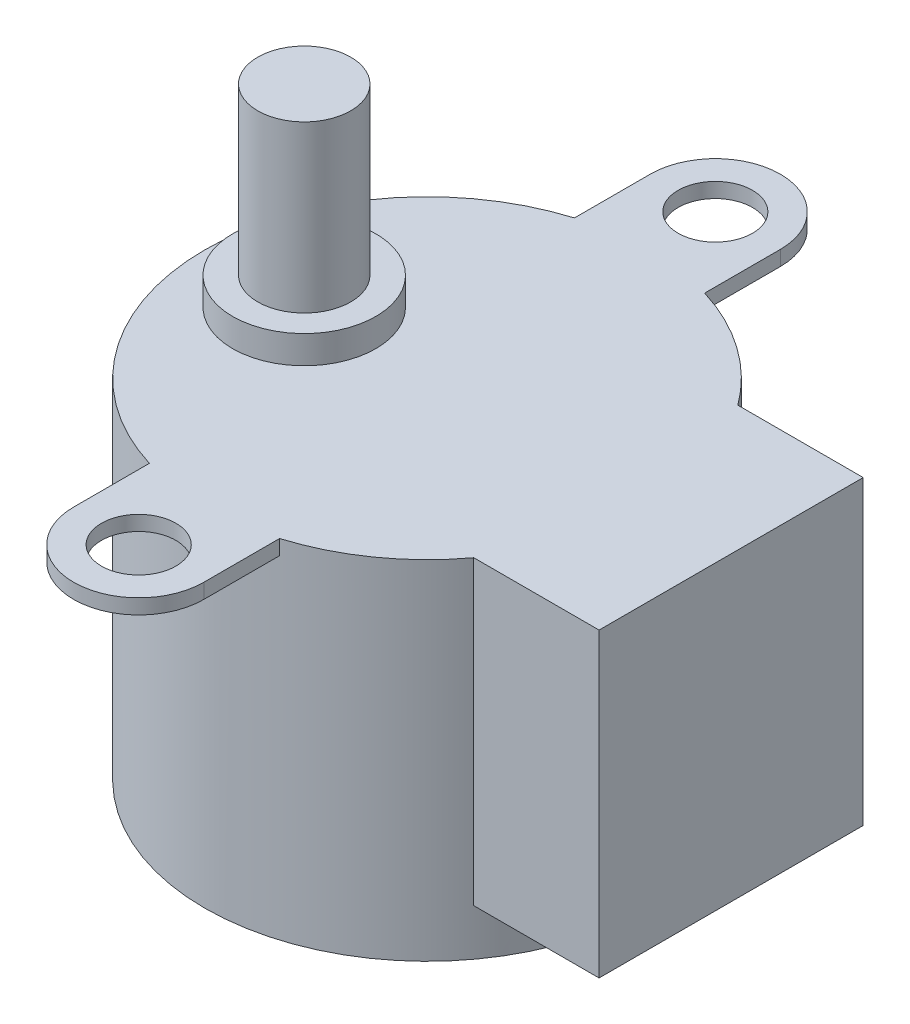
ISO-10303-21;
HEADER;
FILE_DESCRIPTION(('STEP AP214'),'2;1');
FILE_NAME('part.step','',(''),(''),'','','');
FILE_SCHEMA(('AUTOMOTIVE_DESIGN { 1 0 10303 214 1 1 1 1 }'));
ENDSEC;
DATA;
#1=APPLICATION_CONTEXT('core data for automotive mechanical design processes');
#2=APPLICATION_PROTOCOL_DEFINITION('international standard','automotive_design',2000,#1);
#3=PRODUCT_CONTEXT('',#1,'mechanical');
#4=PRODUCT('Part','Part','',(#3));
#5=PRODUCT_RELATED_PRODUCT_CATEGORY('part','',(#4));
#6=PRODUCT_DEFINITION_FORMATION('','',#4);
#7=PRODUCT_DEFINITION_CONTEXT('part definition',#1,'design');
#8=PRODUCT_DEFINITION('design','',#6,#7);
#9=PRODUCT_DEFINITION_SHAPE('','',#8);
#10=(LENGTH_UNIT() NAMED_UNIT(*) SI_UNIT(.MILLI.,.METRE.));
#11=(NAMED_UNIT(*) PLANE_ANGLE_UNIT() SI_UNIT($,.RADIAN.));
#12=(NAMED_UNIT(*) SI_UNIT($,.STERADIAN.) SOLID_ANGLE_UNIT());
#13=UNCERTAINTY_MEASURE_WITH_UNIT(LENGTH_MEASURE(1.E-05),#10,'distance_accuracy_value','');
#14=(GEOMETRIC_REPRESENTATION_CONTEXT(3) GLOBAL_UNCERTAINTY_ASSIGNED_CONTEXT((#13)) GLOBAL_UNIT_ASSIGNED_CONTEXT((#10,
#11,#12)) REPRESENTATION_CONTEXT('',''));
#15=CARTESIAN_POINT('',(0.,0.,0.));
#16=DIRECTION('',(0.,0.,1.));
#17=DIRECTION('',(1.,0.,0.));
#18=AXIS2_PLACEMENT_3D('',#15,#16,#17);
#19=CARTESIAN_POINT('',(0.,18.7,0.));
#20=DIRECTION('',(0.,-1.,0.));
#21=DIRECTION('',(0.,0.,-1.));
#22=AXIS2_PLACEMENT_3D('',#19,#20,#21);
#23=CYLINDRICAL_SURFACE('',#22,11.95);
#24=CARTESIAN_POINT('',(0.,0.,0.));
#25=DIRECTION('',(0.,1.,0.));
#26=DIRECTION('',(0.,0.,1.));
#27=AXIS2_PLACEMENT_3D('',#24,#25,#26);
#28=CIRCLE('',#27,11.95);
#29=CARTESIAN_POINT('',(0.,0.,11.95));
#30=VERTEX_POINT('',#29);
#31=EDGE_CURVE('E38',#30,#30,#28,.T.);
#32=ORIENTED_EDGE('',*,*,#31,.T.);
#33=EDGE_LOOP('',(#32));
#34=FACE_BOUND('',#33,.T.);
#35=CARTESIAN_POINT('',(0.,18.7,0.));
#36=DIRECTION('',(0.,1.,0.));
#37=DIRECTION('',(0.,0.,1.));
#38=AXIS2_PLACEMENT_3D('',#35,#36,#37);
#39=CIRCLE('',#38,11.95);
#40=CARTESIAN_POINT('',(3.5,18.7,11.4259572903105));
#41=VERTEX_POINT('',#40);
#42=CARTESIAN_POINT('',(9.61210174727671,18.7,7.1));
#43=VERTEX_POINT('',#42);
#44=EDGE_CURVE('E44',#41,#43,#39,.T.);
#45=ORIENTED_EDGE('',*,*,#44,.F.);
#46=DIRECTION('',(0.,1.,0.));
#47=VECTOR('',#46,1.);
#48=CARTESIAN_POINT('',(3.5,17.9,11.4259572903105));
#49=LINE('',#48,#47);
#50=CARTESIAN_POINT('',(3.5,17.9,11.4259572903105));
#51=VERTEX_POINT('',#50);
#52=EDGE_CURVE('E143',#51,#41,#49,.T.);
#53=ORIENTED_EDGE('',*,*,#52,.F.);
#54=CARTESIAN_POINT('',(0.,17.9,0.));
#55=DIRECTION('',(0.,1.,0.));
#56=DIRECTION('',(0.,0.,1.));
#57=AXIS2_PLACEMENT_3D('',#54,#55,#56);
#58=CIRCLE('',#57,11.95);
#59=CARTESIAN_POINT('',(-3.5,17.9,11.4259572903105));
#60=VERTEX_POINT('',#59);
#61=EDGE_CURVE('E127',#60,#51,#58,.T.);
#62=ORIENTED_EDGE('',*,*,#61,.F.);
#63=DIRECTION('',(0.,1.,0.));
#64=VECTOR('',#63,1.);
#65=CARTESIAN_POINT('',(-3.5,17.9,11.4259572903105));
#66=LINE('',#65,#64);
#67=CARTESIAN_POINT('',(-3.5,18.7,11.4259572903105));
#68=VERTEX_POINT('',#67);
#69=EDGE_CURVE('E149',#60,#68,#66,.T.);
#70=ORIENTED_EDGE('',*,*,#69,.T.);
#71=CARTESIAN_POINT('',(-3.5,18.7,-11.4259572903105));
#72=VERTEX_POINT('',#71);
#73=EDGE_CURVE('E43',#72,#68,#39,.T.);
#74=ORIENTED_EDGE('',*,*,#73,.F.);
#75=DIRECTION('',(0.,1.,0.));
#76=VECTOR('',#75,1.);
#77=CARTESIAN_POINT('',(-3.5,17.9,-11.4259572903105));
#78=LINE('',#77,#76);
#79=CARTESIAN_POINT('',(-3.5,17.9,-11.4259572903105));
#80=VERTEX_POINT('',#79);
#81=EDGE_CURVE('E185',#80,#72,#78,.T.);
#82=ORIENTED_EDGE('',*,*,#81,.F.);
#83=CARTESIAN_POINT('',(0.,17.9,0.));
#84=DIRECTION('',(0.,1.,0.));
#85=DIRECTION('',(0.,0.,1.));
#86=AXIS2_PLACEMENT_3D('',#83,#84,#85);
#87=CIRCLE('',#86,11.95);
#88=CARTESIAN_POINT('',(3.5,17.9,-11.4259572903105));
#89=VERTEX_POINT('',#88);
#90=EDGE_CURVE('E170',#89,#80,#87,.T.);
#91=ORIENTED_EDGE('',*,*,#90,.F.);
#92=DIRECTION('',(0.,1.,0.));
#93=VECTOR('',#92,1.);
#94=CARTESIAN_POINT('',(3.5,17.9,-11.4259572903105));
#95=LINE('',#94,#93);
#96=CARTESIAN_POINT('',(3.5,18.7,-11.4259572903105));
#97=VERTEX_POINT('',#96);
#98=EDGE_CURVE('E181',#89,#97,#95,.T.);
#99=ORIENTED_EDGE('',*,*,#98,.T.);
#100=CARTESIAN_POINT('',(9.61210174727671,18.7,-7.1));
#101=VERTEX_POINT('',#100);
#102=EDGE_CURVE('E11',#101,#97,#39,.T.);
#103=ORIENTED_EDGE('',*,*,#102,.F.);
#104=DIRECTION('',(0.,1.,0.));
#105=VECTOR('',#104,1.);
#106=CARTESIAN_POINT('',(9.61210174727671,2.5,-7.1));
#107=LINE('',#106,#105);
#108=CARTESIAN_POINT('',(9.61210174727671,2.5,-7.1));
#109=VERTEX_POINT('',#108);
#110=EDGE_CURVE('E208',#109,#101,#107,.T.);
#111=ORIENTED_EDGE('',*,*,#110,.F.);
#112=CARTESIAN_POINT('',(0.,2.5,0.));
#113=DIRECTION('',(0.,1.,0.));
#114=DIRECTION('',(0.,0.,1.));
#115=AXIS2_PLACEMENT_3D('',#112,#113,#114);
#116=CIRCLE('',#115,11.95);
#117=CARTESIAN_POINT('',(9.61210174727671,2.5,7.1));
#118=VERTEX_POINT('',#117);
#119=EDGE_CURVE('E190',#118,#109,#116,.T.);
#120=ORIENTED_EDGE('',*,*,#119,.F.);
#121=DIRECTION('',(0.,1.,0.));
#122=VECTOR('',#121,1.);
#123=CARTESIAN_POINT('',(9.61210174727671,2.5,7.1));
#124=LINE('',#123,#122);
#125=EDGE_CURVE('E201',#118,#43,#124,.T.);
#126=ORIENTED_EDGE('',*,*,#125,.T.);
#127=EDGE_LOOP('',(#45,#53,#62,#70,#74,#82,#91,#99,#103,#111,#120,#126));
#128=FACE_BOUND('',#127,.T.);
#129=ADVANCED_FACE('F35',(#34,#128),#23,.T.);
#130=CARTESIAN_POINT('',(0.,18.7,0.));
#131=DIRECTION('',(0.,1.,0.));
#132=DIRECTION('',(0.,0.,1.));
#133=AXIS2_PLACEMENT_3D('',#130,#131,#132);
#134=PLANE('',#133);
#135=CARTESIAN_POINT('',(-6.6,18.7,0.));
#136=DIRECTION('',(0.,1.,0.));
#137=DIRECTION('',(0.,0.,1.));
#138=AXIS2_PLACEMENT_3D('',#135,#136,#137);
#139=CIRCLE('',#138,3.85);
#140=CARTESIAN_POINT('',(-6.6,18.7,3.85));
#141=VERTEX_POINT('',#140);
#142=EDGE_CURVE('E474',#141,#141,#139,.T.);
#143=ORIENTED_EDGE('',*,*,#142,.F.);
#144=EDGE_LOOP('',(#143));
#145=FACE_BOUND('',#144,.T.);
#146=ORIENTED_EDGE('',*,*,#102,.T.);
#147=DIRECTION('',(0.,0.,1.));
#148=VECTOR('',#147,1.);
#149=CARTESIAN_POINT('',(3.50000000000001,18.7,0.));
#150=LINE('',#149,#148);
#151=CARTESIAN_POINT('',(3.49999999999999,18.7,-15.5));
#152=VERTEX_POINT('',#151);
#153=EDGE_CURVE('E176',#152,#97,#150,.T.);
#154=ORIENTED_EDGE('',*,*,#153,.F.);
#155=CARTESIAN_POINT('',(0.,18.7,-15.5));
#156=DIRECTION('',(0.,1.,0.));
#157=DIRECTION('',(0.,0.,1.));
#158=AXIS2_PLACEMENT_3D('',#155,#156,#157);
#159=CIRCLE('',#158,3.5);
#160=CARTESIAN_POINT('',(-3.50000000000001,18.7,-15.5));
#161=VERTEX_POINT('',#160);
#162=EDGE_CURVE('E178',#152,#161,#159,.T.);
#163=ORIENTED_EDGE('',*,*,#162,.T.);
#164=DIRECTION('',(0.,0.,1.));
#165=VECTOR('',#164,1.);
#166=CARTESIAN_POINT('',(-3.49999999999998,18.7,0.));
#167=LINE('',#166,#165);
#168=EDGE_CURVE('E58',#161,#72,#167,.T.);
#169=ORIENTED_EDGE('',*,*,#168,.T.);
#170=ORIENTED_EDGE('',*,*,#73,.T.);
#171=DIRECTION('',(0.,0.,-1.));
#172=VECTOR('',#171,1.);
#173=CARTESIAN_POINT('',(-3.49999999999999,18.7,0.));
#174=LINE('',#173,#172);
#175=CARTESIAN_POINT('',(-3.5,18.7,15.5));
#176=VERTEX_POINT('',#175);
#177=EDGE_CURVE('E466',#176,#68,#174,.T.);
#178=ORIENTED_EDGE('',*,*,#177,.F.);
#179=CARTESIAN_POINT('',(0.,18.7,15.5));
#180=DIRECTION('',(0.,1.,0.));
#181=DIRECTION('',(0.,0.,1.));
#182=AXIS2_PLACEMENT_3D('',#179,#180,#181);
#183=CIRCLE('',#182,3.5);
#184=CARTESIAN_POINT('',(3.5,18.7,15.5));
#185=VERTEX_POINT('',#184);
#186=EDGE_CURVE('E464',#176,#185,#183,.T.);
#187=ORIENTED_EDGE('',*,*,#186,.T.);
#188=DIRECTION('',(0.,0.,-1.));
#189=VECTOR('',#188,1.);
#190=CARTESIAN_POINT('',(3.5,18.7,0.));
#191=LINE('',#190,#189);
#192=EDGE_CURVE('E51',#185,#41,#191,.T.);
#193=ORIENTED_EDGE('',*,*,#192,.T.);
#194=ORIENTED_EDGE('',*,*,#44,.T.);
#195=DIRECTION('',(-1.,0.,0.));
#196=VECTOR('',#195,1.);
#197=CARTESIAN_POINT('',(0.,18.7,7.1));
#198=LINE('',#197,#196);
#199=CARTESIAN_POINT('',(16.35,18.7,7.1));
#200=VERTEX_POINT('',#199);
#201=EDGE_CURVE('E184',#200,#43,#198,.T.);
#202=ORIENTED_EDGE('',*,*,#201,.F.);
#203=DIRECTION('',(0.,0.,-1.));
#204=VECTOR('',#203,1.);
#205=CARTESIAN_POINT('',(16.35,18.7,0.));
#206=LINE('',#205,#204);
#207=CARTESIAN_POINT('',(16.35,18.7,-7.1));
#208=VERTEX_POINT('',#207);
#209=EDGE_CURVE('E204',#200,#208,#206,.T.);
#210=ORIENTED_EDGE('',*,*,#209,.T.);
#211=DIRECTION('',(-1.,0.,0.));
#212=VECTOR('',#211,1.);
#213=CARTESIAN_POINT('',(0.,18.7,-7.1));
#214=LINE('',#213,#212);
#215=EDGE_CURVE('E193',#208,#101,#214,.T.);
#216=ORIENTED_EDGE('',*,*,#215,.T.);
#217=EDGE_LOOP('',(#146,#154,#163,#169,#170,#178,#187,#193,#194,#202,#210,#216));
#218=FACE_BOUND('',#217,.T.);
#219=CARTESIAN_POINT('',(0.,18.7,-15.5));
#220=DIRECTION('',(0.,1.,0.));
#221=DIRECTION('',(0.,0.,1.));
#222=AXIS2_PLACEMENT_3D('',#219,#220,#221);
#223=CIRCLE('',#222,2.);
#224=CARTESIAN_POINT('',(0.,18.7,-13.5));
#225=VERTEX_POINT('',#224);
#226=EDGE_CURVE('E173',#225,#225,#223,.T.);
#227=ORIENTED_EDGE('',*,*,#226,.F.);
#228=EDGE_LOOP('',(#227));
#229=FACE_BOUND('',#228,.T.);
#230=CARTESIAN_POINT('',(0.,18.7,15.5));
#231=DIRECTION('',(0.,1.,0.));
#232=DIRECTION('',(0.,0.,1.));
#233=AXIS2_PLACEMENT_3D('',#230,#231,#232);
#234=CIRCLE('',#233,2.);
#235=CARTESIAN_POINT('',(0.,18.7,17.5));
#236=VERTEX_POINT('',#235);
#237=EDGE_CURVE('E146',#236,#236,#234,.T.);
#238=ORIENTED_EDGE('',*,*,#237,.F.);
#239=EDGE_LOOP('',(#238));
#240=FACE_BOUND('',#239,.T.);
#241=ADVANCED_FACE('F224',(#145,#218,#229,#240),#134,.T.);
#242=CARTESIAN_POINT('',(0.,0.,0.));
#243=DIRECTION('',(0.,1.,0.));
#244=DIRECTION('',(0.,0.,1.));
#245=AXIS2_PLACEMENT_3D('',#242,#243,#244);
#246=PLANE('',#245);
#247=ORIENTED_EDGE('',*,*,#31,.F.);
#248=EDGE_LOOP('',(#247));
#249=FACE_BOUND('',#248,.T.);
#250=ADVANCED_FACE('F253',(#249),#246,.F.);
#251=CARTESIAN_POINT('',(0.,2.5,-7.1));
#252=DIRECTION('',(0.,0.,-1.));
#253=DIRECTION('',(-1.,0.,0.));
#254=AXIS2_PLACEMENT_3D('',#251,#252,#253);
#255=PLANE('',#254);
#256=ORIENTED_EDGE('',*,*,#215,.F.);
#257=DIRECTION('',(0.,1.,0.));
#258=VECTOR('',#257,1.);
#259=CARTESIAN_POINT('',(16.35,2.5,-7.1));
#260=LINE('',#259,#258);
#261=CARTESIAN_POINT('',(16.35,2.5,-7.1));
#262=VERTEX_POINT('',#261);
#263=EDGE_CURVE('E211',#262,#208,#260,.T.);
#264=ORIENTED_EDGE('',*,*,#263,.F.);
#265=DIRECTION('',(-1.,0.,0.));
#266=VECTOR('',#265,1.);
#267=CARTESIAN_POINT('',(0.,2.5,-7.1));
#268=LINE('',#267,#266);
#269=EDGE_CURVE('E198',#262,#109,#268,.T.);
#270=ORIENTED_EDGE('',*,*,#269,.T.);
#271=ORIENTED_EDGE('',*,*,#110,.T.);
#272=EDGE_LOOP('',(#256,#264,#270,#271));
#273=FACE_BOUND('',#272,.T.);
#274=ADVANCED_FACE('F231',(#273),#255,.T.);
#275=CARTESIAN_POINT('',(16.35,2.5,0.));
#276=DIRECTION('',(1.,0.,0.));
#277=DIRECTION('',(0.,0.,-1.));
#278=AXIS2_PLACEMENT_3D('',#275,#276,#277);
#279=PLANE('',#278);
#280=ORIENTED_EDGE('',*,*,#209,.F.);
#281=DIRECTION('',(0.,1.,0.));
#282=VECTOR('',#281,1.);
#283=CARTESIAN_POINT('',(16.35,2.5,7.1));
#284=LINE('',#283,#282);
#285=CARTESIAN_POINT('',(16.35,2.5,7.1));
#286=VERTEX_POINT('',#285);
#287=EDGE_CURVE('E213',#286,#200,#284,.T.);
#288=ORIENTED_EDGE('',*,*,#287,.F.);
#289=DIRECTION('',(0.,0.,-1.));
#290=VECTOR('',#289,1.);
#291=CARTESIAN_POINT('',(16.35,2.5,0.));
#292=LINE('',#291,#290);
#293=EDGE_CURVE('E195',#286,#262,#292,.T.);
#294=ORIENTED_EDGE('',*,*,#293,.T.);
#295=ORIENTED_EDGE('',*,*,#263,.T.);
#296=EDGE_LOOP('',(#280,#288,#294,#295));
#297=FACE_BOUND('',#296,.T.);
#298=ADVANCED_FACE('F228',(#297),#279,.T.);
#299=CARTESIAN_POINT('',(0.,2.5,7.1));
#300=DIRECTION('',(0.,0.,-1.));
#301=DIRECTION('',(-1.,0.,0.));
#302=AXIS2_PLACEMENT_3D('',#299,#300,#301);
#303=PLANE('',#302);
#304=ORIENTED_EDGE('',*,*,#201,.T.);
#305=ORIENTED_EDGE('',*,*,#125,.F.);
#306=DIRECTION('',(-1.,0.,0.));
#307=VECTOR('',#306,1.);
#308=CARTESIAN_POINT('',(0.,2.5,7.1));
#309=LINE('',#308,#307);
#310=EDGE_CURVE('E192',#286,#118,#309,.T.);
#311=ORIENTED_EDGE('',*,*,#310,.F.);
#312=ORIENTED_EDGE('',*,*,#287,.T.);
#313=EDGE_LOOP('',(#304,#305,#311,#312));
#314=FACE_BOUND('',#313,.T.);
#315=ADVANCED_FACE('F220',(#314),#303,.F.);
#316=CARTESIAN_POINT('',(0.,2.5,0.));
#317=DIRECTION('',(0.,1.,0.));
#318=DIRECTION('',(0.,0.,1.));
#319=AXIS2_PLACEMENT_3D('',#316,#317,#318);
#320=PLANE('',#319);
#321=ORIENTED_EDGE('',*,*,#119,.T.);
#322=ORIENTED_EDGE('',*,*,#269,.F.);
#323=ORIENTED_EDGE('',*,*,#293,.F.);
#324=ORIENTED_EDGE('',*,*,#310,.T.);
#325=EDGE_LOOP('',(#321,#322,#323,#324));
#326=FACE_BOUND('',#325,.T.);
#327=ADVANCED_FACE('F350',(#326),#320,.F.);
#328=CARTESIAN_POINT('',(3.50000000000001,17.9,0.));
#329=DIRECTION('',(-1.,0.,0.));
#330=DIRECTION('',(0.,0.,1.));
#331=AXIS2_PLACEMENT_3D('',#328,#329,#330);
#332=PLANE('',#331);
#333=ORIENTED_EDGE('',*,*,#153,.T.);
#334=ORIENTED_EDGE('',*,*,#98,.F.);
#335=DIRECTION('',(0.,0.,1.));
#336=VECTOR('',#335,1.);
#337=CARTESIAN_POINT('',(3.50000000000001,17.9,0.));
#338=LINE('',#337,#336);
#339=CARTESIAN_POINT('',(3.49999999999999,17.9,-15.5));
#340=VERTEX_POINT('',#339);
#341=EDGE_CURVE('E162',#340,#89,#338,.T.);
#342=ORIENTED_EDGE('',*,*,#341,.F.);
#343=DIRECTION('',(0.,1.,0.));
#344=VECTOR('',#343,1.);
#345=CARTESIAN_POINT('',(3.49999999999999,17.9,-15.5));
#346=LINE('',#345,#344);
#347=EDGE_CURVE('E172',#340,#152,#346,.T.);
#348=ORIENTED_EDGE('',*,*,#347,.T.);
#349=EDGE_LOOP('',(#333,#334,#342,#348));
#350=FACE_BOUND('',#349,.T.);
#351=ADVANCED_FACE('F240',(#350),#332,.F.);
#352=CARTESIAN_POINT('',(-3.49999999999998,17.9,0.));
#353=DIRECTION('',(-1.,0.,0.));
#354=DIRECTION('',(0.,0.,1.));
#355=AXIS2_PLACEMENT_3D('',#352,#353,#354);
#356=PLANE('',#355);
#357=ORIENTED_EDGE('',*,*,#168,.F.);
#358=DIRECTION('',(0.,1.,0.));
#359=VECTOR('',#358,1.);
#360=CARTESIAN_POINT('',(-3.50000000000001,17.9,-15.5));
#361=LINE('',#360,#359);
#362=CARTESIAN_POINT('',(-3.50000000000001,17.9,-15.5));
#363=VERTEX_POINT('',#362);
#364=EDGE_CURVE('E187',#363,#161,#361,.T.);
#365=ORIENTED_EDGE('',*,*,#364,.F.);
#366=DIRECTION('',(0.,0.,1.));
#367=VECTOR('',#366,1.);
#368=CARTESIAN_POINT('',(-3.49999999999998,17.9,0.));
#369=LINE('',#368,#367);
#370=EDGE_CURVE('E167',#363,#80,#369,.T.);
#371=ORIENTED_EDGE('',*,*,#370,.T.);
#372=ORIENTED_EDGE('',*,*,#81,.T.);
#373=EDGE_LOOP('',(#357,#365,#371,#372));
#374=FACE_BOUND('',#373,.T.);
#375=ADVANCED_FACE('F246',(#374),#356,.T.);
#376=CARTESIAN_POINT('',(0.,17.9,-15.5));
#377=DIRECTION('',(0.,1.,0.));
#378=DIRECTION('',(0.,0.,1.));
#379=AXIS2_PLACEMENT_3D('',#376,#377,#378);
#380=CYLINDRICAL_SURFACE('',#379,2.);
#381=CARTESIAN_POINT('',(0.,17.9,-15.5));
#382=DIRECTION('',(0.,1.,0.));
#383=DIRECTION('',(0.,0.,1.));
#384=AXIS2_PLACEMENT_3D('',#381,#382,#383);
#385=CIRCLE('',#384,2.);
#386=CARTESIAN_POINT('',(0.,17.9,-13.5));
#387=VERTEX_POINT('',#386);
#388=EDGE_CURVE('E159',#387,#387,#385,.T.);
#389=ORIENTED_EDGE('',*,*,#388,.F.);
#390=EDGE_LOOP('',(#389));
#391=FACE_BOUND('',#390,.T.);
#392=ORIENTED_EDGE('',*,*,#226,.T.);
#393=EDGE_LOOP('',(#392));
#394=FACE_BOUND('',#393,.T.);
#395=ADVANCED_FACE('F345',(#391,#394),#380,.F.);
#396=CARTESIAN_POINT('',(0.,17.9,-15.5));
#397=DIRECTION('',(0.,1.,0.));
#398=DIRECTION('',(0.,0.,1.));
#399=AXIS2_PLACEMENT_3D('',#396,#397,#398);
#400=CYLINDRICAL_SURFACE('',#399,3.5);
#401=ORIENTED_EDGE('',*,*,#162,.F.);
#402=ORIENTED_EDGE('',*,*,#347,.F.);
#403=CARTESIAN_POINT('',(0.,17.9,-15.5));
#404=DIRECTION('',(0.,1.,0.));
#405=DIRECTION('',(0.,0.,1.));
#406=AXIS2_PLACEMENT_3D('',#403,#404,#405);
#407=CIRCLE('',#406,3.5);
#408=EDGE_CURVE('E164',#340,#363,#407,.T.);
#409=ORIENTED_EDGE('',*,*,#408,.T.);
#410=ORIENTED_EDGE('',*,*,#364,.T.);
#411=EDGE_LOOP('',(#401,#402,#409,#410));
#412=FACE_BOUND('',#411,.T.);
#413=ADVANCED_FACE('F243',(#412),#400,.T.);
#414=CARTESIAN_POINT('',(0.,17.9,0.));
#415=DIRECTION('',(0.,1.,0.));
#416=DIRECTION('',(0.,0.,1.));
#417=AXIS2_PLACEMENT_3D('',#414,#415,#416);
#418=PLANE('',#417);
#419=ORIENTED_EDGE('',*,*,#388,.T.);
#420=EDGE_LOOP('',(#419));
#421=FACE_BOUND('',#420,.T.);
#422=ORIENTED_EDGE('',*,*,#341,.T.);
#423=ORIENTED_EDGE('',*,*,#90,.T.);
#424=ORIENTED_EDGE('',*,*,#370,.F.);
#425=ORIENTED_EDGE('',*,*,#408,.F.);
#426=EDGE_LOOP('',(#422,#423,#424,#425));
#427=FACE_BOUND('',#426,.T.);
#428=ADVANCED_FACE('F339',(#421,#427),#418,.F.);
#429=CARTESIAN_POINT('',(3.5,17.9,0.));
#430=DIRECTION('',(1.,0.,0.));
#431=DIRECTION('',(0.,0.,-1.));
#432=AXIS2_PLACEMENT_3D('',#429,#430,#431);
#433=PLANE('',#432);
#434=ORIENTED_EDGE('',*,*,#192,.F.);
#435=DIRECTION('',(0.,1.,0.));
#436=VECTOR('',#435,1.);
#437=CARTESIAN_POINT('',(3.5,17.9,15.5));
#438=LINE('',#437,#436);
#439=CARTESIAN_POINT('',(3.5,17.9,15.5));
#440=VERTEX_POINT('',#439);
#441=EDGE_CURVE('E145',#440,#185,#438,.T.);
#442=ORIENTED_EDGE('',*,*,#441,.F.);
#443=DIRECTION('',(0.,0.,-1.));
#444=VECTOR('',#443,1.);
#445=CARTESIAN_POINT('',(3.5,17.9,0.));
#446=LINE('',#445,#444);
#447=EDGE_CURVE('E132',#440,#51,#446,.T.);
#448=ORIENTED_EDGE('',*,*,#447,.T.);
#449=ORIENTED_EDGE('',*,*,#52,.T.);
#450=EDGE_LOOP('',(#434,#442,#448,#449));
#451=FACE_BOUND('',#450,.T.);
#452=ADVANCED_FACE('F142',(#451),#433,.T.);
#453=CARTESIAN_POINT('',(0.,17.9,15.5));
#454=DIRECTION('',(0.,1.,0.));
#455=DIRECTION('',(0.,0.,1.));
#456=AXIS2_PLACEMENT_3D('',#453,#454,#455);
#457=CYLINDRICAL_SURFACE('',#456,3.5);
#458=ORIENTED_EDGE('',*,*,#186,.F.);
#459=DIRECTION('',(0.,1.,0.));
#460=VECTOR('',#459,1.);
#461=CARTESIAN_POINT('',(-3.5,17.9,15.5));
#462=LINE('',#461,#460);
#463=CARTESIAN_POINT('',(-3.5,17.9,15.5));
#464=VERTEX_POINT('',#463);
#465=EDGE_CURVE('E152',#464,#176,#462,.T.);
#466=ORIENTED_EDGE('',*,*,#465,.F.);
#467=CARTESIAN_POINT('',(0.,17.9,15.5));
#468=DIRECTION('',(0.,1.,0.));
#469=DIRECTION('',(0.,0.,1.));
#470=AXIS2_PLACEMENT_3D('',#467,#468,#469);
#471=CIRCLE('',#470,3.5);
#472=EDGE_CURVE('E155',#464,#440,#471,.T.);
#473=ORIENTED_EDGE('',*,*,#472,.T.);
#474=ORIENTED_EDGE('',*,*,#441,.T.);
#475=EDGE_LOOP('',(#458,#466,#473,#474));
#476=FACE_BOUND('',#475,.T.);
#477=ADVANCED_FACE('F330',(#476),#457,.T.);
#478=CARTESIAN_POINT('',(-3.49999999999999,17.9,0.));
#479=DIRECTION('',(1.,0.,0.));
#480=DIRECTION('',(0.,0.,-1.));
#481=AXIS2_PLACEMENT_3D('',#478,#479,#480);
#482=PLANE('',#481);
#483=ORIENTED_EDGE('',*,*,#177,.T.);
#484=ORIENTED_EDGE('',*,*,#69,.F.);
#485=DIRECTION('',(0.,0.,-1.));
#486=VECTOR('',#485,1.);
#487=CARTESIAN_POINT('',(-3.49999999999999,17.9,0.));
#488=LINE('',#487,#486);
#489=EDGE_CURVE('E135',#464,#60,#488,.T.);
#490=ORIENTED_EDGE('',*,*,#489,.F.);
#491=ORIENTED_EDGE('',*,*,#465,.T.);
#492=EDGE_LOOP('',(#483,#484,#490,#491));
#493=FACE_BOUND('',#492,.T.);
#494=ADVANCED_FACE('F328',(#493),#482,.F.);
#495=CARTESIAN_POINT('',(0.,17.9,15.5));
#496=DIRECTION('',(0.,1.,0.));
#497=DIRECTION('',(0.,0.,1.));
#498=AXIS2_PLACEMENT_3D('',#495,#496,#497);
#499=CYLINDRICAL_SURFACE('',#498,2.);
#500=CARTESIAN_POINT('',(0.,17.9,15.5));
#501=DIRECTION('',(0.,1.,0.));
#502=DIRECTION('',(0.,0.,1.));
#503=AXIS2_PLACEMENT_3D('',#500,#501,#502);
#504=CIRCLE('',#503,2.);
#505=CARTESIAN_POINT('',(0.,17.9,17.5));
#506=VERTEX_POINT('',#505);
#507=EDGE_CURVE('E150',#506,#506,#504,.T.);
#508=ORIENTED_EDGE('',*,*,#507,.F.);
#509=EDGE_LOOP('',(#508));
#510=FACE_BOUND('',#509,.T.);
#511=ORIENTED_EDGE('',*,*,#237,.T.);
#512=EDGE_LOOP('',(#511));
#513=FACE_BOUND('',#512,.T.);
#514=ADVANCED_FACE('F325',(#510,#513),#499,.F.);
#515=CARTESIAN_POINT('',(0.,17.9,0.));
#516=DIRECTION('',(0.,1.,0.));
#517=DIRECTION('',(0.,0.,1.));
#518=AXIS2_PLACEMENT_3D('',#515,#516,#517);
#519=PLANE('',#518);
#520=ORIENTED_EDGE('',*,*,#447,.F.);
#521=ORIENTED_EDGE('',*,*,#472,.F.);
#522=ORIENTED_EDGE('',*,*,#489,.T.);
#523=ORIENTED_EDGE('',*,*,#61,.T.);
#524=EDGE_LOOP('',(#520,#521,#522,#523));
#525=FACE_BOUND('',#524,.T.);
#526=ORIENTED_EDGE('',*,*,#507,.T.);
#527=EDGE_LOOP('',(#526));
#528=FACE_BOUND('',#527,.T.);
#529=ADVANCED_FACE('F129',(#525,#528),#519,.F.);
#530=CARTESIAN_POINT('',(-6.6,20.2,0.));
#531=DIRECTION('',(0.,-1.,0.));
#532=DIRECTION('',(0.,0.,-1.));
#533=AXIS2_PLACEMENT_3D('',#530,#531,#532);
#534=CYLINDRICAL_SURFACE('',#533,3.85);
#535=CARTESIAN_POINT('',(-6.6,20.2,0.));
#536=DIRECTION('',(0.,1.,0.));
#537=DIRECTION('',(0.,0.,1.));
#538=AXIS2_PLACEMENT_3D('',#535,#536,#537);
#539=CIRCLE('',#538,3.85);
#540=CARTESIAN_POINT('',(-6.6,20.2,3.85));
#541=VERTEX_POINT('',#540);
#542=EDGE_CURVE('E471',#541,#541,#539,.T.);
#543=ORIENTED_EDGE('',*,*,#542,.F.);
#544=EDGE_LOOP('',(#543));
#545=FACE_BOUND('',#544,.T.);
#546=ORIENTED_EDGE('',*,*,#142,.T.);
#547=EDGE_LOOP('',(#546));
#548=FACE_BOUND('',#547,.T.);
#549=ADVANCED_FACE('F283',(#545,#548),#534,.T.);
#550=CARTESIAN_POINT('',(-6.6,20.2,0.));
#551=DIRECTION('',(0.,1.,0.));
#552=DIRECTION('',(0.,0.,1.));
#553=AXIS2_PLACEMENT_3D('',#550,#551,#552);
#554=PLANE('',#553);
#555=CARTESIAN_POINT('',(-6.6,20.2,0.));
#556=DIRECTION('',(0.,1.,0.));
#557=DIRECTION('',(0.,0.,1.));
#558=AXIS2_PLACEMENT_3D('',#555,#556,#557);
#559=CIRCLE('',#558,2.5);
#560=CARTESIAN_POINT('',(-6.6,20.2,2.5));
#561=VERTEX_POINT('',#560);
#562=EDGE_CURVE('E482',#561,#561,#559,.T.);
#563=ORIENTED_EDGE('',*,*,#562,.F.);
#564=EDGE_LOOP('',(#563));
#565=FACE_BOUND('',#564,.T.);
#566=ORIENTED_EDGE('',*,*,#542,.T.);
#567=EDGE_LOOP('',(#566));
#568=FACE_BOUND('',#567,.T.);
#569=ADVANCED_FACE('F288',(#565,#568),#554,.T.);
#570=CARTESIAN_POINT('',(-6.6,29.1,0.));
#571=DIRECTION('',(0.,-1.,0.));
#572=DIRECTION('',(0.,0.,-1.));
#573=AXIS2_PLACEMENT_3D('',#570,#571,#572);
#574=CYLINDRICAL_SURFACE('',#573,2.5);
#575=CARTESIAN_POINT('',(-6.6,29.1,0.));
#576=DIRECTION('',(0.,1.,0.));
#577=DIRECTION('',(0.,0.,1.));
#578=AXIS2_PLACEMENT_3D('',#575,#576,#577);
#579=CIRCLE('',#578,2.5);
#580=CARTESIAN_POINT('',(-6.6,29.1,2.5));
#581=VERTEX_POINT('',#580);
#582=EDGE_CURVE('E480',#581,#581,#579,.T.);
#583=ORIENTED_EDGE('',*,*,#582,.F.);
#584=EDGE_LOOP('',(#583));
#585=FACE_BOUND('',#584,.T.);
#586=ORIENTED_EDGE('',*,*,#562,.T.);
#587=EDGE_LOOP('',(#586));
#588=FACE_BOUND('',#587,.T.);
#589=ADVANCED_FACE('F298',(#585,#588),#574,.T.);
#590=CARTESIAN_POINT('',(-6.6,29.1,0.));
#591=DIRECTION('',(0.,1.,0.));
#592=DIRECTION('',(0.,0.,1.));
#593=AXIS2_PLACEMENT_3D('',#590,#591,#592);
#594=PLANE('',#593);
#595=ORIENTED_EDGE('',*,*,#582,.T.);
#596=EDGE_LOOP('',(#595));
#597=FACE_BOUND('',#596,.T.);
#598=ADVANCED_FACE('F308',(#597),#594,.T.);
#599=CLOSED_SHELL('',(#129,#241,#250,#274,#298,#315,#327,#351,#375,#395,#413,#428,#452,#477,
#494,#514,#529,#549,#569,#589,#598));
#600=MANIFOLD_SOLID_BREP('B2',#599);
#601=ADVANCED_BREP_SHAPE_REPRESENTATION('',(#18,#600),#14);
#602=SHAPE_DEFINITION_REPRESENTATION(#9,#601);
ENDSEC;
END-ISO-10303-21;
